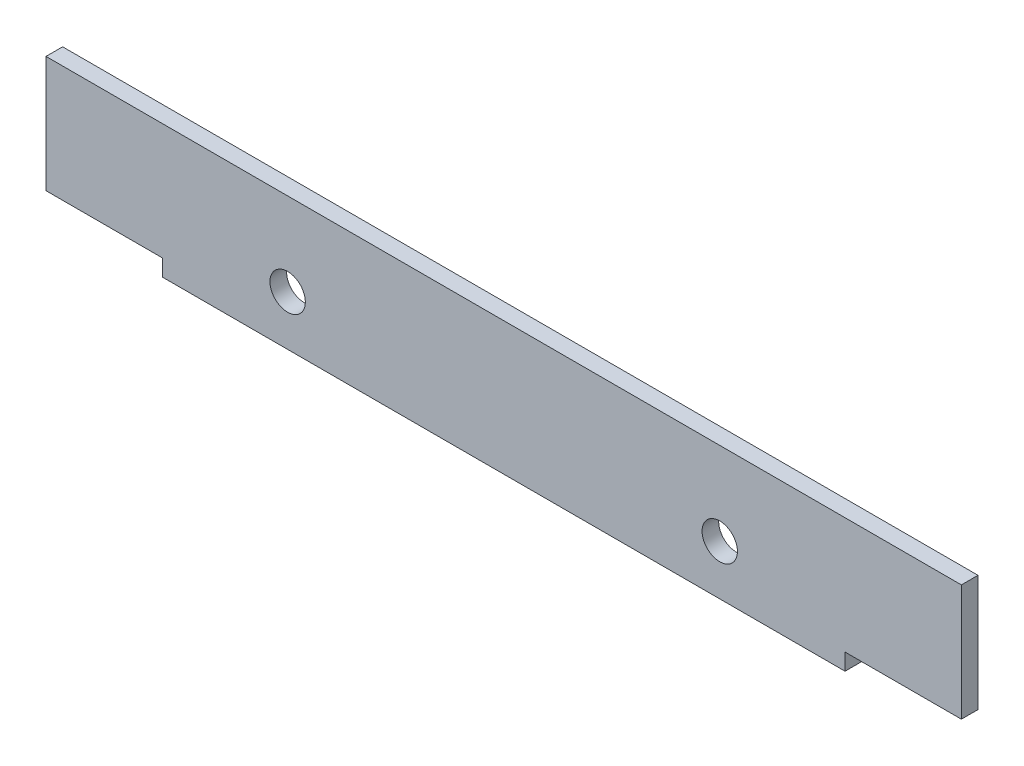
ISO-10303-21;
HEADER;
FILE_DESCRIPTION(('STEP AP214'),'2;1');
FILE_NAME('part.step','',(''),(''),'','','');
FILE_SCHEMA(('AUTOMOTIVE_DESIGN { 1 0 10303 214 1 1 1 1 }'));
ENDSEC;
DATA;
#1=APPLICATION_CONTEXT('core data for automotive mechanical design processes');
#2=APPLICATION_PROTOCOL_DEFINITION('international standard','automotive_design',2000,#1);
#3=PRODUCT_CONTEXT('',#1,'mechanical');
#4=PRODUCT('Part','Part','',(#3));
#5=PRODUCT_RELATED_PRODUCT_CATEGORY('part','',(#4));
#6=PRODUCT_DEFINITION_FORMATION('','',#4);
#7=PRODUCT_DEFINITION_CONTEXT('part definition',#1,'design');
#8=PRODUCT_DEFINITION('design','',#6,#7);
#9=PRODUCT_DEFINITION_SHAPE('','',#8);
#10=(LENGTH_UNIT() NAMED_UNIT(*) SI_UNIT(.MILLI.,.METRE.));
#11=(NAMED_UNIT(*) PLANE_ANGLE_UNIT() SI_UNIT($,.RADIAN.));
#12=(NAMED_UNIT(*) SI_UNIT($,.STERADIAN.) SOLID_ANGLE_UNIT());
#13=UNCERTAINTY_MEASURE_WITH_UNIT(LENGTH_MEASURE(1.E-05),#10,'distance_accuracy_value','');
#14=(GEOMETRIC_REPRESENTATION_CONTEXT(3) GLOBAL_UNCERTAINTY_ASSIGNED_CONTEXT((#13)) GLOBAL_UNIT_ASSIGNED_CONTEXT((#10,
#11,#12)) REPRESENTATION_CONTEXT('',''));
#15=CARTESIAN_POINT('',(0.,0.,0.));
#16=DIRECTION('',(0.,0.,1.));
#17=DIRECTION('',(1.,0.,0.));
#18=AXIS2_PLACEMENT_3D('',#15,#16,#17);
#19=CARTESIAN_POINT('',(0.,0.,3.175));
#20=DIRECTION('',(-1.,0.,0.));
#21=DIRECTION('',(0.,-1.,0.));
#22=AXIS2_PLACEMENT_3D('',#19,#20,#21);
#23=PLANE('',#22);
#24=DIRECTION('',(0.,0.,1.));
#25=VECTOR('',#24,1.);
#26=CARTESIAN_POINT('',(0.,-22.225,0.));
#27=LINE('',#26,#25);
#28=CARTESIAN_POINT('',(0.,-22.225,0.));
#29=VERTEX_POINT('',#28);
#30=CARTESIAN_POINT('',(0.,-22.225,3.175));
#31=VERTEX_POINT('',#30);
#32=EDGE_CURVE('E97',#29,#31,#27,.T.);
#33=ORIENTED_EDGE('',*,*,#32,.F.);
#34=DIRECTION('',(0.,1.,0.));
#35=VECTOR('',#34,1.);
#36=CARTESIAN_POINT('',(0.,0.,0.));
#37=LINE('',#36,#35);
#38=CARTESIAN_POINT('',(0.,0.,0.));
#39=VERTEX_POINT('',#38);
#40=EDGE_CURVE('E108',#29,#39,#37,.T.);
#41=ORIENTED_EDGE('',*,*,#40,.T.);
#42=DIRECTION('',(0.,0.,-1.));
#43=VECTOR('',#42,1.);
#44=CARTESIAN_POINT('',(0.,0.,3.175));
#45=LINE('',#44,#43);
#46=CARTESIAN_POINT('',(0.,0.,3.175));
#47=VERTEX_POINT('',#46);
#48=EDGE_CURVE('E11',#47,#39,#45,.T.);
#49=ORIENTED_EDGE('',*,*,#48,.F.);
#50=DIRECTION('',(0.,1.,0.));
#51=VECTOR('',#50,1.);
#52=CARTESIAN_POINT('',(0.,0.,3.175));
#53=LINE('',#52,#51);
#54=EDGE_CURVE('E110',#31,#47,#53,.T.);
#55=ORIENTED_EDGE('',*,*,#54,.F.);
#56=EDGE_LOOP('',(#33,#41,#49,#55));
#57=FACE_BOUND('',#56,.T.);
#58=ADVANCED_FACE('F32',(#57),#23,.F.);
#59=CARTESIAN_POINT('',(0.,-25.4,3.175));
#60=DIRECTION('',(0.,1.,0.));
#61=DIRECTION('',(-1.,0.,0.));
#62=AXIS2_PLACEMENT_3D('',#59,#60,#61);
#63=PLANE('',#62);
#64=DIRECTION('',(0.,0.,1.));
#65=VECTOR('',#64,1.);
#66=CARTESIAN_POINT('',(-22.225,-25.4,0.));
#67=LINE('',#66,#65);
#68=CARTESIAN_POINT('',(-22.225,-25.4,0.));
#69=VERTEX_POINT('',#68);
#70=CARTESIAN_POINT('',(-22.225,-25.4,3.175));
#71=VERTEX_POINT('',#70);
#72=EDGE_CURVE('E155',#69,#71,#67,.T.);
#73=ORIENTED_EDGE('',*,*,#72,.T.);
#74=DIRECTION('',(1.,0.,0.));
#75=VECTOR('',#74,1.);
#76=CARTESIAN_POINT('',(0.,-25.4,3.175));
#77=LINE('',#76,#75);
#78=CARTESIAN_POINT('',(-152.654,-25.4,3.175));
#79=VERTEX_POINT('',#78);
#80=EDGE_CURVE('E123',#79,#71,#77,.T.);
#81=ORIENTED_EDGE('',*,*,#80,.F.);
#82=DIRECTION('',(0.,0.,1.));
#83=VECTOR('',#82,1.);
#84=CARTESIAN_POINT('',(-152.654,-25.4,0.));
#85=LINE('',#84,#83);
#86=CARTESIAN_POINT('',(-152.654,-25.4,0.));
#87=VERTEX_POINT('',#86);
#88=EDGE_CURVE('E146',#87,#79,#85,.T.);
#89=ORIENTED_EDGE('',*,*,#88,.F.);
#90=DIRECTION('',(1.,0.,0.));
#91=VECTOR('',#90,1.);
#92=CARTESIAN_POINT('',(0.,-25.4,0.));
#93=LINE('',#92,#91);
#94=EDGE_CURVE('E128',#87,#69,#93,.T.);
#95=ORIENTED_EDGE('',*,*,#94,.T.);
#96=EDGE_LOOP('',(#73,#81,#89,#95));
#97=FACE_BOUND('',#96,.T.);
#98=ADVANCED_FACE('F184',(#97),#63,.F.);
#99=CARTESIAN_POINT('',(0.,-25.4,3.175));
#100=DIRECTION('',(0.,0.,-1.));
#101=DIRECTION('',(-1.,0.,0.));
#102=AXIS2_PLACEMENT_3D('',#99,#100,#101);
#103=PLANE('',#102);
#104=CARTESIAN_POINT('',(-46.1645,-15.875,3.175));
#105=DIRECTION('',(0.,0.,1.));
#106=DIRECTION('',(1.,0.,0.));
#107=AXIS2_PLACEMENT_3D('',#104,#105,#106);
#108=CIRCLE('',#107,3.37819999999998);
#109=CARTESIAN_POINT('',(-42.7863,-15.875,3.175));
#110=VERTEX_POINT('',#109);
#111=EDGE_CURVE('E175',#110,#110,#108,.T.);
#112=ORIENTED_EDGE('',*,*,#111,.F.);
#113=EDGE_LOOP('',(#112));
#114=FACE_BOUND('',#113,.T.);
#115=CARTESIAN_POINT('',(-128.7145,-15.875,3.175));
#116=DIRECTION('',(0.,0.,1.));
#117=DIRECTION('',(1.,0.,0.));
#118=AXIS2_PLACEMENT_3D('',#115,#116,#117);
#119=CIRCLE('',#118,3.3782);
#120=CARTESIAN_POINT('',(-125.3363,-15.875,3.175));
#121=VERTEX_POINT('',#120);
#122=EDGE_CURVE('E169',#121,#121,#119,.T.);
#123=ORIENTED_EDGE('',*,*,#122,.F.);
#124=EDGE_LOOP('',(#123));
#125=FACE_BOUND('',#124,.T.);
#126=DIRECTION('',(0.,1.,0.));
#127=VECTOR('',#126,1.);
#128=CARTESIAN_POINT('',(-22.225,-25.4,3.175));
#129=LINE('',#128,#127);
#130=CARTESIAN_POINT('',(-22.225,-22.225,3.175));
#131=VERTEX_POINT('',#130);
#132=EDGE_CURVE('E103',#71,#131,#129,.T.);
#133=ORIENTED_EDGE('',*,*,#132,.T.);
#134=DIRECTION('',(1.,0.,0.));
#135=VECTOR('',#134,1.);
#136=CARTESIAN_POINT('',(0.,-22.225,3.175));
#137=LINE('',#136,#135);
#138=EDGE_CURVE('E163',#131,#31,#137,.T.);
#139=ORIENTED_EDGE('',*,*,#138,.T.);
#140=ORIENTED_EDGE('',*,*,#54,.T.);
#141=DIRECTION('',(-1.,0.,0.));
#142=VECTOR('',#141,1.);
#143=CARTESIAN_POINT('',(0.,0.,3.175));
#144=LINE('',#143,#142);
#145=CARTESIAN_POINT('',(-174.879,0.,3.175));
#146=VERTEX_POINT('',#145);
#147=EDGE_CURVE('E141',#47,#146,#144,.T.);
#148=ORIENTED_EDGE('',*,*,#147,.T.);
#149=DIRECTION('',(0.,-1.,0.));
#150=VECTOR('',#149,1.);
#151=CARTESIAN_POINT('',(-174.879,0.,3.175));
#152=LINE('',#151,#150);
#153=CARTESIAN_POINT('',(-174.879,-22.225,3.175));
#154=VERTEX_POINT('',#153);
#155=EDGE_CURVE('E135',#146,#154,#152,.T.);
#156=ORIENTED_EDGE('',*,*,#155,.T.);
#157=DIRECTION('',(-1.,0.,0.));
#158=VECTOR('',#157,1.);
#159=CARTESIAN_POINT('',(-174.879,-22.225,3.175));
#160=LINE('',#159,#158);
#161=CARTESIAN_POINT('',(-152.654,-22.225,3.175));
#162=VERTEX_POINT('',#161);
#163=EDGE_CURVE('E149',#162,#154,#160,.T.);
#164=ORIENTED_EDGE('',*,*,#163,.F.);
#165=DIRECTION('',(0.,1.,0.));
#166=VECTOR('',#165,1.);
#167=CARTESIAN_POINT('',(-152.654,-25.4,3.175));
#168=LINE('',#167,#166);
#169=EDGE_CURVE('E152',#79,#162,#168,.T.);
#170=ORIENTED_EDGE('',*,*,#169,.F.);
#171=ORIENTED_EDGE('',*,*,#80,.T.);
#172=EDGE_LOOP('',(#133,#139,#140,#148,#156,#164,#170,#171));
#173=FACE_BOUND('',#172,.T.);
#174=ADVANCED_FACE('F181',(#114,#125,#173),#103,.F.);
#175=CARTESIAN_POINT('',(0.,-25.4,0.));
#176=DIRECTION('',(0.,0.,-1.));
#177=DIRECTION('',(-1.,0.,0.));
#178=AXIS2_PLACEMENT_3D('',#175,#176,#177);
#179=PLANE('',#178);
#180=CARTESIAN_POINT('',(-46.1645,-15.875,0.));
#181=DIRECTION('',(0.,0.,1.));
#182=DIRECTION('',(1.,0.,0.));
#183=AXIS2_PLACEMENT_3D('',#180,#181,#182);
#184=CIRCLE('',#183,3.3782);
#185=CARTESIAN_POINT('',(-42.7863,-15.875,0.));
#186=VERTEX_POINT('',#185);
#187=EDGE_CURVE('E172',#186,#186,#184,.T.);
#188=ORIENTED_EDGE('',*,*,#187,.T.);
#189=EDGE_LOOP('',(#188));
#190=FACE_BOUND('',#189,.T.);
#191=CARTESIAN_POINT('',(-128.7145,-15.875,0.));
#192=DIRECTION('',(0.,0.,1.));
#193=DIRECTION('',(1.,0.,0.));
#194=AXIS2_PLACEMENT_3D('',#191,#192,#193);
#195=CIRCLE('',#194,3.3782);
#196=CARTESIAN_POINT('',(-125.3363,-15.875,0.));
#197=VERTEX_POINT('',#196);
#198=EDGE_CURVE('E165',#197,#197,#195,.T.);
#199=ORIENTED_EDGE('',*,*,#198,.T.);
#200=EDGE_LOOP('',(#199));
#201=FACE_BOUND('',#200,.T.);
#202=DIRECTION('',(1.,0.,0.));
#203=VECTOR('',#202,1.);
#204=CARTESIAN_POINT('',(0.,-22.225,0.));
#205=LINE('',#204,#203);
#206=CARTESIAN_POINT('',(-22.225,-22.225,0.));
#207=VERTEX_POINT('',#206);
#208=EDGE_CURVE('E94',#207,#29,#205,.T.);
#209=ORIENTED_EDGE('',*,*,#208,.F.);
#210=DIRECTION('',(0.,1.,0.));
#211=VECTOR('',#210,1.);
#212=CARTESIAN_POINT('',(-22.225,-25.4,0.));
#213=LINE('',#212,#211);
#214=EDGE_CURVE('E102',#69,#207,#213,.T.);
#215=ORIENTED_EDGE('',*,*,#214,.F.);
#216=ORIENTED_EDGE('',*,*,#94,.F.);
#217=DIRECTION('',(0.,1.,0.));
#218=VECTOR('',#217,1.);
#219=CARTESIAN_POINT('',(-152.654,-25.4,0.));
#220=LINE('',#219,#218);
#221=CARTESIAN_POINT('',(-152.654,-22.225,0.));
#222=VERTEX_POINT('',#221);
#223=EDGE_CURVE('E151',#87,#222,#220,.T.);
#224=ORIENTED_EDGE('',*,*,#223,.T.);
#225=DIRECTION('',(-1.,0.,0.));
#226=VECTOR('',#225,1.);
#227=CARTESIAN_POINT('',(-174.879,-22.225,0.));
#228=LINE('',#227,#226);
#229=CARTESIAN_POINT('',(-174.879,-22.225,0.));
#230=VERTEX_POINT('',#229);
#231=EDGE_CURVE('E54',#222,#230,#228,.T.);
#232=ORIENTED_EDGE('',*,*,#231,.T.);
#233=DIRECTION('',(0.,-1.,0.));
#234=VECTOR('',#233,1.);
#235=CARTESIAN_POINT('',(-174.879,0.,0.));
#236=LINE('',#235,#234);
#237=CARTESIAN_POINT('',(-174.879,0.,0.));
#238=VERTEX_POINT('',#237);
#239=EDGE_CURVE('E117',#238,#230,#236,.T.);
#240=ORIENTED_EDGE('',*,*,#239,.F.);
#241=DIRECTION('',(-1.,0.,0.));
#242=VECTOR('',#241,1.);
#243=CARTESIAN_POINT('',(0.,0.,0.));
#244=LINE('',#243,#242);
#245=EDGE_CURVE('E114',#39,#238,#244,.T.);
#246=ORIENTED_EDGE('',*,*,#245,.F.);
#247=ORIENTED_EDGE('',*,*,#40,.F.);
#248=EDGE_LOOP('',(#209,#215,#216,#224,#232,#240,#246,#247));
#249=FACE_BOUND('',#248,.T.);
#250=ADVANCED_FACE('F112',(#190,#201,#249),#179,.T.);
#251=CARTESIAN_POINT('',(0.,0.,3.175));
#252=DIRECTION('',(0.,-1.,0.));
#253=DIRECTION('',(1.,0.,0.));
#254=AXIS2_PLACEMENT_3D('',#251,#252,#253);
#255=PLANE('',#254);
#256=ORIENTED_EDGE('',*,*,#245,.T.);
#257=DIRECTION('',(0.,0.,-1.));
#258=VECTOR('',#257,1.);
#259=CARTESIAN_POINT('',(-174.879,0.,3.175));
#260=LINE('',#259,#258);
#261=EDGE_CURVE('E39',#146,#238,#260,.T.);
#262=ORIENTED_EDGE('',*,*,#261,.F.);
#263=ORIENTED_EDGE('',*,*,#147,.F.);
#264=ORIENTED_EDGE('',*,*,#48,.T.);
#265=EDGE_LOOP('',(#256,#262,#263,#264));
#266=FACE_BOUND('',#265,.T.);
#267=ADVANCED_FACE('F197',(#266),#255,.F.);
#268=CARTESIAN_POINT('',(-174.879,0.,3.175));
#269=DIRECTION('',(1.,0.,0.));
#270=DIRECTION('',(0.,0.,-1.));
#271=AXIS2_PLACEMENT_3D('',#268,#269,#270);
#272=PLANE('',#271);
#273=ORIENTED_EDGE('',*,*,#239,.T.);
#274=DIRECTION('',(0.,0.,1.));
#275=VECTOR('',#274,1.);
#276=CARTESIAN_POINT('',(-174.879,-22.225,0.));
#277=LINE('',#276,#275);
#278=EDGE_CURVE('E115',#230,#154,#277,.T.);
#279=ORIENTED_EDGE('',*,*,#278,.T.);
#280=ORIENTED_EDGE('',*,*,#155,.F.);
#281=ORIENTED_EDGE('',*,*,#261,.T.);
#282=EDGE_LOOP('',(#273,#279,#280,#281));
#283=FACE_BOUND('',#282,.T.);
#284=ADVANCED_FACE('F195',(#283),#272,.F.);
#285=CARTESIAN_POINT('',(-174.879,-22.225,0.));
#286=DIRECTION('',(0.,1.,0.));
#287=DIRECTION('',(0.,0.,1.));
#288=AXIS2_PLACEMENT_3D('',#285,#286,#287);
#289=PLANE('',#288);
#290=ORIENTED_EDGE('',*,*,#163,.T.);
#291=ORIENTED_EDGE('',*,*,#278,.F.);
#292=ORIENTED_EDGE('',*,*,#231,.F.);
#293=DIRECTION('',(0.,0.,1.));
#294=VECTOR('',#293,1.);
#295=CARTESIAN_POINT('',(-152.654,-22.225,0.));
#296=LINE('',#295,#294);
#297=EDGE_CURVE('E120',#222,#162,#296,.T.);
#298=ORIENTED_EDGE('',*,*,#297,.T.);
#299=EDGE_LOOP('',(#290,#291,#292,#298));
#300=FACE_BOUND('',#299,.T.);
#301=ADVANCED_FACE('F194',(#300),#289,.F.);
#302=CARTESIAN_POINT('',(-152.654,-25.4,0.));
#303=DIRECTION('',(1.,0.,0.));
#304=DIRECTION('',(0.,0.,-1.));
#305=AXIS2_PLACEMENT_3D('',#302,#303,#304);
#306=PLANE('',#305);
#307=ORIENTED_EDGE('',*,*,#169,.T.);
#308=ORIENTED_EDGE('',*,*,#297,.F.);
#309=ORIENTED_EDGE('',*,*,#223,.F.);
#310=ORIENTED_EDGE('',*,*,#88,.T.);
#311=EDGE_LOOP('',(#307,#308,#309,#310));
#312=FACE_BOUND('',#311,.T.);
#313=ADVANCED_FACE('F193',(#312),#306,.F.);
#314=CARTESIAN_POINT('',(-22.225,-25.4,0.));
#315=DIRECTION('',(1.,0.,0.));
#316=DIRECTION('',(0.,1.,0.));
#317=AXIS2_PLACEMENT_3D('',#314,#315,#316);
#318=PLANE('',#317);
#319=ORIENTED_EDGE('',*,*,#132,.F.);
#320=ORIENTED_EDGE('',*,*,#72,.F.);
#321=ORIENTED_EDGE('',*,*,#214,.T.);
#322=DIRECTION('',(0.,0.,1.));
#323=VECTOR('',#322,1.);
#324=CARTESIAN_POINT('',(-22.225,-22.225,0.));
#325=LINE('',#324,#323);
#326=EDGE_CURVE('E46',#207,#131,#325,.T.);
#327=ORIENTED_EDGE('',*,*,#326,.T.);
#328=EDGE_LOOP('',(#319,#320,#321,#327));
#329=FACE_BOUND('',#328,.T.);
#330=ADVANCED_FACE('F188',(#329),#318,.T.);
#331=CARTESIAN_POINT('',(0.,-22.225,0.));
#332=DIRECTION('',(0.,-1.,0.));
#333=DIRECTION('',(1.,0.,0.));
#334=AXIS2_PLACEMENT_3D('',#331,#332,#333);
#335=PLANE('',#334);
#336=ORIENTED_EDGE('',*,*,#138,.F.);
#337=ORIENTED_EDGE('',*,*,#326,.F.);
#338=ORIENTED_EDGE('',*,*,#208,.T.);
#339=ORIENTED_EDGE('',*,*,#32,.T.);
#340=EDGE_LOOP('',(#336,#337,#338,#339));
#341=FACE_BOUND('',#340,.T.);
#342=ADVANCED_FACE('F96',(#341),#335,.T.);
#343=CARTESIAN_POINT('',(-128.7145,-15.875,3.175));
#344=DIRECTION('',(0.,0.,1.));
#345=DIRECTION('',(1.,0.,0.));
#346=AXIS2_PLACEMENT_3D('',#343,#344,#345);
#347=CYLINDRICAL_SURFACE('',#346,3.3782);
#348=ORIENTED_EDGE('',*,*,#198,.F.);
#349=EDGE_LOOP('',(#348));
#350=FACE_BOUND('',#349,.T.);
#351=ORIENTED_EDGE('',*,*,#122,.T.);
#352=EDGE_LOOP('',(#351));
#353=FACE_BOUND('',#352,.T.);
#354=ADVANCED_FACE('F220',(#350,#353),#347,.F.);
#355=CARTESIAN_POINT('',(-46.1645,-15.875,3.175));
#356=DIRECTION('',(0.,0.,1.));
#357=DIRECTION('',(1.,0.,0.));
#358=AXIS2_PLACEMENT_3D('',#355,#356,#357);
#359=CYLINDRICAL_SURFACE('',#358,3.37819999999999);
#360=ORIENTED_EDGE('',*,*,#187,.F.);
#361=EDGE_LOOP('',(#360));
#362=FACE_BOUND('',#361,.T.);
#363=ORIENTED_EDGE('',*,*,#111,.T.);
#364=EDGE_LOOP('',(#363));
#365=FACE_BOUND('',#364,.T.);
#366=ADVANCED_FACE('F179',(#362,#365),#359,.F.);
#367=CLOSED_SHELL('',(#58,#98,#174,#250,#267,#284,#301,#313,#330,#342,#354,#366));
#368=MANIFOLD_SOLID_BREP('B2',#367);
#369=ADVANCED_BREP_SHAPE_REPRESENTATION('',(#18,#368),#14);
#370=SHAPE_DEFINITION_REPRESENTATION(#9,#369);
ENDSEC;
END-ISO-10303-21;
